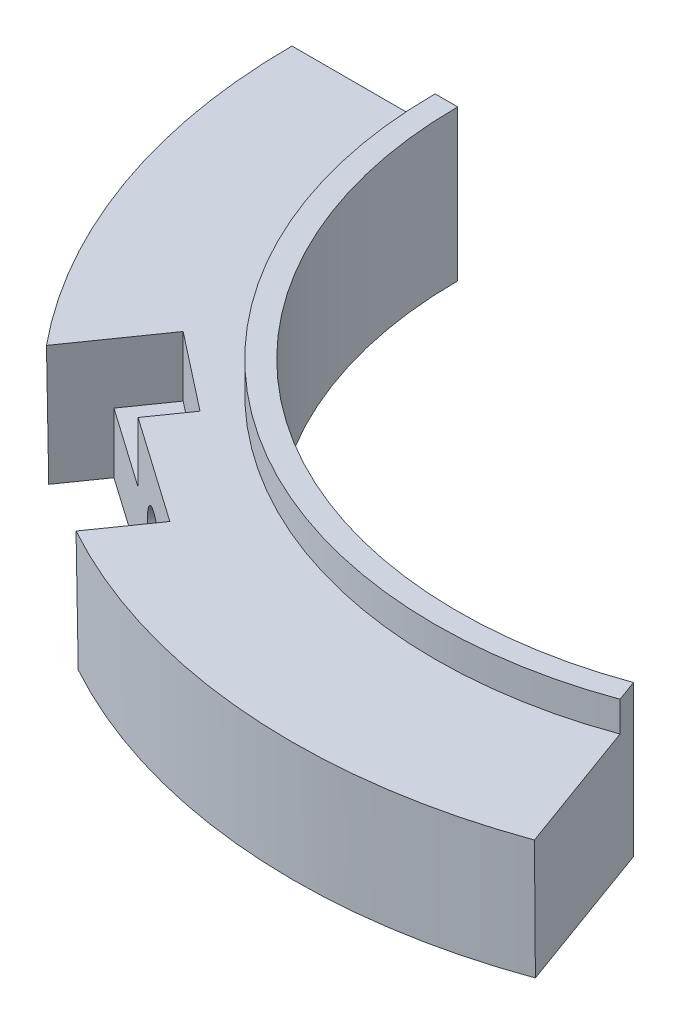
ISO-10303-21;
HEADER;
FILE_DESCRIPTION(('STEP AP214'),'2;1');
FILE_NAME('part.step','',(''),(''),'','','');
FILE_SCHEMA(('AUTOMOTIVE_DESIGN { 1 0 10303 214 1 1 1 1 }'));
ENDSEC;
DATA;
#1=APPLICATION_CONTEXT('core data for automotive mechanical design processes');
#2=APPLICATION_PROTOCOL_DEFINITION('international standard','automotive_design',2000,#1);
#3=PRODUCT_CONTEXT('',#1,'mechanical');
#4=PRODUCT('Part','Part','',(#3));
#5=PRODUCT_RELATED_PRODUCT_CATEGORY('part','',(#4));
#6=PRODUCT_DEFINITION_FORMATION('','',#4);
#7=PRODUCT_DEFINITION_CONTEXT('part definition',#1,'design');
#8=PRODUCT_DEFINITION('design','',#6,#7);
#9=PRODUCT_DEFINITION_SHAPE('','',#8);
#10=(LENGTH_UNIT() NAMED_UNIT(*) SI_UNIT(.MILLI.,.METRE.));
#11=(NAMED_UNIT(*) PLANE_ANGLE_UNIT() SI_UNIT($,.RADIAN.));
#12=(NAMED_UNIT(*) SI_UNIT($,.STERADIAN.) SOLID_ANGLE_UNIT());
#13=UNCERTAINTY_MEASURE_WITH_UNIT(LENGTH_MEASURE(1.E-05),#10,'distance_accuracy_value','');
#14=(GEOMETRIC_REPRESENTATION_CONTEXT(3) GLOBAL_UNCERTAINTY_ASSIGNED_CONTEXT((#13)) GLOBAL_UNIT_ASSIGNED_CONTEXT((#10,
#11,#12)) REPRESENTATION_CONTEXT('',''));
#15=CARTESIAN_POINT('',(0.,0.,0.));
#16=DIRECTION('',(0.,0.,1.));
#17=DIRECTION('',(1.,0.,0.));
#18=AXIS2_PLACEMENT_3D('',#15,#16,#17);
#19=CARTESIAN_POINT('',(0.,7.99999999999999,0.));
#20=DIRECTION('',(0.,1.,0.));
#21=DIRECTION('',(0.,0.,1.));
#22=AXIS2_PLACEMENT_3D('',#19,#20,#21);
#23=CONICAL_SURFACE('',#22,40.,0.0129481160065154);
#24=CARTESIAN_POINT('',(0.,0.000670605463265819,0.));
#25=DIRECTION('',(0.,-1.,0.));
#26=DIRECTION('',(0.,0.,-1.));
#27=AXIS2_PLACEMENT_3D('',#24,#25,#26);
#28=CIRCLE('',#27,39.8964179663232);
#29=CARTESIAN_POINT('',(-30.8760915944179,0.00067060546326582,25.2664032738471));
#30=VERTEX_POINT('',#29);
#31=CARTESIAN_POINT('',(-39.8964179663232,0.000670605463265819,0.));
#32=VERTEX_POINT('',#31);
#33=EDGE_CURVE('E285',#30,#32,#28,.T.);
#34=ORIENTED_EDGE('',*,*,#33,.F.);
#35=CARTESIAN_POINT('',(-30.8760900513762,0.000470605463265819,25.2664010701552));
#36=CARTESIAN_POINT('',(-30.8863766462704,1.33375881323339,25.2810918501495));
#37=CARTESIAN_POINT('',(-30.8966627154944,2.66704703332985,25.2957818794091));
#38=CARTESIAN_POINT('',(-30.9172338026023,5.33362349817542,25.3251604364587));
#39=CARTESIAN_POINT('',(-30.9275188204861,6.66691174292454,25.3398489642488));
#40=CARTESIAN_POINT('',(-30.9378033126998,8.0002,25.3545367413041));
#41=B_SPLINE_CURVE_WITH_KNOTS('',3,(#35,#36,#37,#38,#39,#40),.UNSPECIFIED.,.F.,.F.,(4,2,4),(0.,
4.00022645637086,8.00045291274171),.UNSPECIFIED.);
#42=CARTESIAN_POINT('',(-30.9378017699736,8.,25.3545345380628));
#43=VERTEX_POINT('',#42);
#44=EDGE_CURVE('E168',#30,#43,#41,.T.);
#45=ORIENTED_EDGE('',*,*,#44,.T.);
#46=CARTESIAN_POINT('',(0.,7.99999999999999,0.));
#47=DIRECTION('',(0.,-1.,0.));
#48=DIRECTION('',(0.,0.,-1.));
#49=AXIS2_PLACEMENT_3D('',#46,#47,#48);
#50=CIRCLE('',#49,40.);
#51=CARTESIAN_POINT('',(-40.,7.99999999999999,0.));
#52=VERTEX_POINT('',#51);
#53=EDGE_CURVE('E306',#43,#52,#50,.T.);
#54=ORIENTED_EDGE('',*,*,#53,.T.);
#55=DIRECTION('',(0.0129477542096046,-0.999916174317091,0.));
#56=VECTOR('',#55,1.);
#57=CARTESIAN_POINT('',(-40.,7.99999999999999,0.));
#58=LINE('',#57,#56);
#59=EDGE_CURVE('E289',#52,#32,#58,.T.);
#60=ORIENTED_EDGE('',*,*,#59,.T.);
#61=EDGE_LOOP('',(#34,#45,#54,#60));
#62=FACE_BOUND('',#61,.T.);
#63=ADVANCED_FACE('F34',(#62),#23,.T.);
#64=CARTESIAN_POINT('',(9.91858415644451,8.,27.2510860027913));
#65=DIRECTION('',(0.,-1.,0.));
#66=DIRECTION('',(0.,0.,-1.));
#67=AXIS2_PLACEMENT_3D('',#64,#65,#66);
#68=PLANE('',#67);
#69=DIRECTION('',(-0.573576436351045,0.,0.819152044288992));
#70=VECTOR('',#69,1.);
#71=CARTESIAN_POINT('',(-29.0934777198865,8.,22.7205668221443));
#72=LINE('',#71,#70);
#73=CARTESIAN_POINT('',(-27.2022359413972,8.,20.0195936459274));
#74=VERTEX_POINT('',#73);
#75=EDGE_CURVE('E169',#74,#43,#72,.T.);
#76=ORIENTED_EDGE('',*,*,#75,.F.);
#77=DIRECTION('',(-0.787674234570857,0.,-0.616091957578749));
#78=VECTOR('',#77,1.);
#79=CARTESIAN_POINT('',(-22.062861899645,8.,24.0394369709254));
#80=LINE('',#79,#78);
#81=CARTESIAN_POINT('',(-22.062861899645,8.,24.0394369709254));
#82=VERTEX_POINT('',#81);
#83=EDGE_CURVE('E155',#82,#74,#80,.T.);
#84=ORIENTED_EDGE('',*,*,#83,.F.);
#85=DIRECTION('',(0.573576436351044,0.,-0.819152044288993));
#86=VECTOR('',#85,1.);
#87=CARTESIAN_POINT('',(-23.7561974212202,8.,26.4577707208086));
#88=LINE('',#87,#86);
#89=CARTESIAN_POINT('',(-23.7561974212202,8.,26.4577707208086));
#90=VERTEX_POINT('',#89);
#91=EDGE_CURVE('E414',#90,#82,#88,.T.);
#92=ORIENTED_EDGE('',*,*,#91,.F.);
#93=DIRECTION('',(-0.819152044288993,0.,-0.573576436351044));
#94=VECTOR('',#93,1.);
#95=CARTESIAN_POINT('',(-0.787343563343156,8.,42.5407353361313));
#96=LINE('',#95,#94);
#97=CARTESIAN_POINT('',(-16.7242818511227,8.,31.3815710110451));
#98=VERTEX_POINT('',#97);
#99=EDGE_CURVE('E322',#98,#90,#96,.T.);
#100=ORIENTED_EDGE('',*,*,#99,.F.);
#101=DIRECTION('',(-0.573576436351045,0.,0.819152044288992));
#102=VECTOR('',#101,1.);
#103=CARTESIAN_POINT('',(-6.01835413133505,8.,16.0919216777051));
#104=LINE('',#103,#102);
#105=CARTESIAN_POINT('',(-19.2877505838145,7.99999999999999,35.0425837719847));
#106=VERTEX_POINT('',#105);
#107=EDGE_CURVE('E231',#98,#106,#104,.T.);
#108=ORIENTED_EDGE('',*,*,#107,.T.);
#109=CARTESIAN_POINT('',(13.6808057330269,7.99999999999999,37.5877048314363));
#110=VERTEX_POINT('',#109);
#111=EDGE_CURVE('E307',#110,#106,#50,.T.);
#112=ORIENTED_EDGE('',*,*,#111,.F.);
#113=DIRECTION('',(0.342020143325673,0.,0.939692620785907));
#114=VECTOR('',#113,1.);
#115=CARTESIAN_POINT('',(9.91858415644451,8.,27.2510860027913));
#116=LINE('',#115,#114);
#117=CARTESIAN_POINT('',(10.431614371433,8.,28.6606249339702));
#118=VERTEX_POINT('',#117);
#119=EDGE_CURVE('E295',#118,#110,#116,.T.);
#120=ORIENTED_EDGE('',*,*,#119,.F.);
#121=CARTESIAN_POINT('',(0.,8.,0.));
#122=DIRECTION('',(0.,-1.,0.));
#123=DIRECTION('',(0.,0.,-1.));
#124=AXIS2_PLACEMENT_3D('',#121,#122,#123);
#125=CIRCLE('',#124,30.5);
#126=CARTESIAN_POINT('',(-30.5,7.99999999999999,0.));
#127=VERTEX_POINT('',#126);
#128=EDGE_CURVE('E324',#118,#127,#125,.T.);
#129=ORIENTED_EDGE('',*,*,#128,.T.);
#130=DIRECTION('',(-1.,0.,0.));
#131=VECTOR('',#130,1.);
#132=CARTESIAN_POINT('',(-29.,8.,0.));
#133=LINE('',#132,#131);
#134=EDGE_CURVE('E337',#127,#52,#133,.T.);
#135=ORIENTED_EDGE('',*,*,#134,.T.);
#136=ORIENTED_EDGE('',*,*,#53,.F.);
#137=EDGE_LOOP('',(#76,#84,#92,#100,#108,#112,#120,#129,#135,#136));
#138=FACE_BOUND('',#137,.T.);
#139=ADVANCED_FACE('F274',(#138),#68,.F.);
#140=CARTESIAN_POINT('',(0.,0.,0.));
#141=DIRECTION('',(0.,-1.,0.));
#142=DIRECTION('',(0.,0.,-1.));
#143=AXIS2_PLACEMENT_3D('',#140,#141,#142);
#144=CYLINDRICAL_SURFACE('',#143,29.);
#145=CARTESIAN_POINT('',(-16.6932287008392,0.649474551576168,23.7136272118265));
#146=CARTESIAN_POINT('',(-16.5489999556268,0.64948214656556,23.8151544921271));
#147=CARTESIAN_POINT('',(-16.4037439585356,0.664338604365094,23.9154215427874));
#148=CARTESIAN_POINT('',(-16.1154682046601,0.723376379007501,24.1106218136091));
#149=CARTESIAN_POINT('',(-15.9724510424347,0.767589464135116,24.2055491345346));
#150=CARTESIAN_POINT('',(-15.6931209410602,0.884033140541949,24.3875733311172));
#151=CARTESIAN_POINT('',(-15.5568038638344,0.956246187246734,24.4746750682164));
#152=CARTESIAN_POINT('',(-15.294984883665,1.12660442333295,24.6391430593461));
#153=CARTESIAN_POINT('',(-15.1694809311329,1.22474468390133,24.7165111596373));
#154=CARTESIAN_POINT('',(-14.932723824081,1.44461432831995,24.8602703957436));
#155=CARTESIAN_POINT('',(-14.821525867094,1.56643077946276,24.9266192859318));
#156=CARTESIAN_POINT('',(-14.6175122704299,1.83000864498745,25.0468039865723));
#157=CARTESIAN_POINT('',(-14.524697507627,1.97177101023343,25.1006392001463));
#158=CARTESIAN_POINT('',(-14.3603233498682,2.27165723790005,25.195042227695));
#159=CARTESIAN_POINT('',(-14.2888180309886,2.42982137568048,25.2355763138507));
#160=CARTESIAN_POINT('',(-14.169836482929,2.7577429622307,25.3025774246436));
#161=CARTESIAN_POINT('',(-14.1223595593769,2.92750007582608,25.3290448557797));
#162=CARTESIAN_POINT('',(-14.0532448125366,3.27307580418684,25.367457175145));
#163=CARTESIAN_POINT('',(-14.0315053730862,3.44886774233842,25.379459178862));
#164=CARTESIAN_POINT('',(-14.0143003498141,3.80211861102713,25.388963895097));
#165=CARTESIAN_POINT('',(-14.0188339587404,3.97957749017943,25.3864670530989));
#166=CARTESIAN_POINT('',(-14.0539344207779,4.33032261974512,25.3670517964536));
#167=CARTESIAN_POINT('',(-14.0843895545301,4.50362350001804,25.3501952704377));
#168=CARTESIAN_POINT('',(-14.1701127401262,4.84194300421424,25.3023772222597));
#169=CARTESIAN_POINT('',(-14.2253811811965,5.00696149817329,25.2714154788404));
#170=CARTESIAN_POINT('',(-14.3589696041779,5.32443095731625,25.1957509769842));
#171=CARTESIAN_POINT('',(-14.4373377924936,5.47685477860741,25.1510194739636));
#172=CARTESIAN_POINT('',(-14.6144522540094,5.76451098077571,25.048517327861));
#173=CARTESIAN_POINT('',(-14.713199231329,5.89974276737966,24.9907462342339));
#174=CARTESIAN_POINT('',(-14.9284159747827,6.14991377023516,24.862785716952));
#175=CARTESIAN_POINT('',(-15.0449753493423,6.26474365242543,24.7925331951435));
#176=CARTESIAN_POINT('',(-15.2917026261313,6.47000258894143,24.6411190007649));
#177=CARTESIAN_POINT('',(-15.4218705480971,6.56043160787822,24.5599573123732));
#178=CARTESIAN_POINT('',(-15.6917707801985,6.7143189095837,24.388396319614));
#179=CARTESIAN_POINT('',(-15.831505196858,6.77777122981352,24.2979949785186));
#180=CARTESIAN_POINT('',(-16.1162226230965,6.87582170067299,24.110089957242));
#181=CARTESIAN_POINT('',(-16.2612054471995,6.91042086992089,24.0125865279217));
#182=CARTESIAN_POINT('',(-16.5513422063985,6.94964323220379,23.813522631559));
#183=CARTESIAN_POINT('',(-16.6964915637939,6.95441721413793,23.7119851889403));
#184=CARTESIAN_POINT('',(-16.9835199275088,6.93425033432527,23.5072569263861));
#185=CARTESIAN_POINT('',(-17.1253989860754,6.90930994763858,23.4040661329097));
#186=CARTESIAN_POINT('',(-17.4016378380506,6.83054745272621,23.199407216518));
#187=CARTESIAN_POINT('',(-17.5360152275116,6.77679636273557,23.0979354879191));
#188=CARTESIAN_POINT('',(-17.7941265933511,6.64201151218522,22.8996848736341));
#189=CARTESIAN_POINT('',(-17.9178602907999,6.56097703690759,22.8029061109613));
#190=CARTESIAN_POINT('',(-18.1520836221764,6.3735546573513,22.6169039581311));
#191=CARTESIAN_POINT('',(-18.2625191840447,6.26706817125197,22.5277118207458));
#192=CARTESIAN_POINT('',(-18.4669570911248,6.03190527229278,22.3604333021115));
#193=CARTESIAN_POINT('',(-18.5609589478609,5.90322820006542,22.2823472509928));
#194=CARTESIAN_POINT('',(-18.7307367590176,5.62667681043193,22.1398254990495));
#195=CARTESIAN_POINT('',(-18.8064332746414,5.47872296180764,22.0754494339169));
#196=CARTESIAN_POINT('',(-18.9373628341602,5.16820810750318,21.9632364607781));
#197=CARTESIAN_POINT('',(-18.9925962008302,5.00564733227533,21.9153992918965));
#198=CARTESIAN_POINT('',(-19.0812659982208,4.67086716025938,21.838240752812));
#199=CARTESIAN_POINT('',(-19.1147468791267,4.49866824612972,21.8088816274592));
#200=CARTESIAN_POINT('',(-19.1593370811455,4.14922552791051,21.7697197390596));
#201=CARTESIAN_POINT('',(-19.1704471702185,3.97198189721136,21.7599163046914));
#202=CARTESIAN_POINT('',(-19.1700483522398,3.61846811660654,21.7602675542439));
#203=CARTESIAN_POINT('',(-19.1586570973353,3.44219771020977,21.7703184265163));
#204=CARTESIAN_POINT('',(-19.1137454613566,3.09471436495632,21.8097596187874));
#205=CARTESIAN_POINT('',(-19.0802250617306,2.92350143033967,21.8391499549993));
#206=CARTESIAN_POINT('',(-18.9918106977869,2.59100061415647,21.9160793683163));
#207=CARTESIAN_POINT('',(-18.9369209739132,2.42971077083976,21.9636148447354));
#208=CARTESIAN_POINT('',(-18.8069865498785,2.12152061542658,22.0749755605313));
#209=CARTESIAN_POINT('',(-18.7319418444426,1.97462030709597,22.1388008041713));
#210=CARTESIAN_POINT('',(-18.5629463616414,1.69858022757664,22.2806916924656));
#211=CARTESIAN_POINT('',(-18.4689025347671,1.5695333503358,22.3588272396232));
#212=CARTESIAN_POINT('',(-18.2642790566204,1.33365812734902,22.5262857730101));
#213=CARTESIAN_POINT('',(-18.1536954712934,1.22683508213214,22.6156114200308));
#214=CARTESIAN_POINT('',(-17.9183153333047,1.03818670109254,22.8025571538631));
#215=CARTESIAN_POINT('',(-17.7934782443324,0.956435226578116,22.9002006858224));
#216=CARTESIAN_POINT('',(-17.5330758769043,0.820783703932582,23.1001751188821));
#217=CARTESIAN_POINT('',(-17.3975227502445,0.766852615959477,23.2025006567244));
#218=CARTESIAN_POINT('',(-17.1666089802473,0.70164951429629,23.373503624662));
#219=CARTESIAN_POINT('',(-17.0732250014389,0.682111074041779,23.4418118157774));
#220=CARTESIAN_POINT('',(-16.8844547725775,0.656021102259471,23.5781412293489));
#221=CARTESIAN_POINT('',(-16.7890685327052,0.649469504714634,23.646162453262));
#222=CARTESIAN_POINT('',(-16.6932287008392,0.649474551576168,23.7136272118265));
#223=B_SPLINE_CURVE_WITH_KNOTS('',3,(#145,#146,#147,#148,#149,#150,#151,#152,#153,#154,#155,
#156,#157,#158,#159,#160,#161,#162,#163,#164,#165,#166,#167,#168,#169,#170,#171,#172,#173,#174,
#175,#176,#177,#178,#179,#180,#181,#182,#183,#184,#185,#186,#187,#188,#189,#190,#191,#192,#193,
#194,#195,#196,#197,#198,#199,#200,#201,#202,#203,#204,#205,#206,#207,#208,#209,#210,#211,#212,
#213,#214,#215,#216,#217,#218,#219,#220,#221,#222),.UNSPECIFIED.,.T.,.F.,(4,2,2,2,2,2,2,2,2,2,2,
2,2,2,2,2,2,2,2,2,2,2,2,2,2,2,2,2,2,2,2,2,2,2,2,2,2,2,4),(0.,0.52871040460765,1.0579938878802,
1.58694626048054,2.11579815048801,2.64663296149886,3.17749308711254,3.7096891019091,
4.24186973644208,4.77194214481608,5.30199826654555,5.82978139684763,6.35757280634521,
6.88647354697578,7.41539256503064,7.94706576503542,8.47873973612954,9.01053115972378,
9.54230380840551,10.0713857534895,10.6004592399601,11.1282345206174,11.6560236279975,
12.1858910981398,12.7157743153923,13.2479173567005,13.7800520039039,14.3110958099924,
14.8421213857274,15.3703777519355,15.898634561005,16.4267865982752,16.9549387737673,
17.4857432095958,18.016674100977,18.5491544232548,19.0810393530426,19.4323685821309,
19.783696025275),.UNSPECIFIED.);
#224=CARTESIAN_POINT('',(-16.6932287008392,0.649474551576168,23.7136272118265));
#225=VERTEX_POINT('',#224);
#226=CARTESIAN_POINT('',(-16.6932287008392,6.94947455157617,23.7136272118265));
#227=VERTEX_POINT('',#226);
#228=EDGE_CURVE('E212',#225,#227,#223,.T.);
#229=ORIENTED_EDGE('',*,*,#228,.T.);
#230=EDGE_CURVE('E220',#227,#225,#223,.T.);
#231=ORIENTED_EDGE('',*,*,#230,.T.);
#232=EDGE_LOOP('',(#229,#231));
#233=FACE_BOUND('',#232,.T.);
#234=CARTESIAN_POINT('',(0.,0.,0.));
#235=DIRECTION('',(0.,-1.,0.));
#236=DIRECTION('',(0.,0.,-1.));
#237=AXIS2_PLACEMENT_3D('',#234,#235,#236);
#238=CIRCLE('',#237,29.);
#239=CARTESIAN_POINT('',(9.91858415644451,0.,27.2510860027913));
#240=VERTEX_POINT('',#239);
#241=CARTESIAN_POINT('',(-29.,0.,0.));
#242=VERTEX_POINT('',#241);
#243=EDGE_CURVE('E62',#240,#242,#238,.T.);
#244=ORIENTED_EDGE('',*,*,#243,.T.);
#245=DIRECTION('',(0.,1.,0.));
#246=VECTOR('',#245,1.);
#247=CARTESIAN_POINT('',(-29.,0.,0.));
#248=LINE('',#247,#246);
#249=CARTESIAN_POINT('',(-29.,10.,0.));
#250=VERTEX_POINT('',#249);
#251=EDGE_CURVE('E278',#242,#250,#248,.T.);
#252=ORIENTED_EDGE('',*,*,#251,.T.);
#253=CARTESIAN_POINT('',(0.,10.,0.));
#254=DIRECTION('',(0.,1.,0.));
#255=DIRECTION('',(0.,0.,1.));
#256=AXIS2_PLACEMENT_3D('',#253,#254,#255);
#257=CIRCLE('',#256,29.);
#258=CARTESIAN_POINT('',(9.9185841564445,10.,27.2510860027913));
#259=VERTEX_POINT('',#258);
#260=EDGE_CURVE('E330',#250,#259,#257,.T.);
#261=ORIENTED_EDGE('',*,*,#260,.T.);
#262=DIRECTION('',(0.,1.,0.));
#263=VECTOR('',#262,1.);
#264=CARTESIAN_POINT('',(9.91858415644451,0.,27.2510860027913));
#265=LINE('',#264,#263);
#266=EDGE_CURVE('E280',#240,#259,#265,.T.);
#267=ORIENTED_EDGE('',*,*,#266,.F.);
#268=EDGE_LOOP('',(#244,#252,#261,#267));
#269=FACE_BOUND('',#268,.T.);
#270=ADVANCED_FACE('F36',(#233,#269),#144,.F.);
#271=CARTESIAN_POINT('',(0.,0.000670605463265819,0.));
#272=DIRECTION('',(0.,1.,0.));
#273=DIRECTION('',(0.,0.,1.));
#274=AXIS2_PLACEMENT_3D('',#271,#272,#273);
#275=CONICAL_SURFACE('',#274,39.8964179663232,1.57073478313307);
#276=CARTESIAN_POINT('',(-29.0936777198865,0.00048707027842584,22.7204267806367));
#277=CARTESIAN_POINT('',(-27.3188482906565,0.000447327702143533,23.96317572602));
#278=CARTESIAN_POINT('',(-25.5440188613637,0.000419544427064887,25.2059246714472));
#279=CARTESIAN_POINT('',(-21.4208202384896,0.000382782929756702,28.0930194287196));
#280=CARTESIAN_POINT('',(-19.0724510448611,0.000382782929756702,29.7373652405977));
#281=CARTESIAN_POINT('',(-16.7240818511227,0.000403720453189899,31.3817110525528));
#282=B_SPLINE_CURVE_WITH_KNOTS('',3,(#276,#277,#278,#279,#280,#281),.UNSPECIFIED.,.F.,.F.,(4,2,
4),(0.,6.5000000005344,15.1004883103699),.UNSPECIFIED.);
#283=CARTESIAN_POINT('',(-29.0934777198865,0.000487065882157831,22.7205668221443));
#284=VERTEX_POINT('',#283);
#285=CARTESIAN_POINT('',(-16.7242818511227,0.000403718636132755,31.3815710110451));
#286=VERTEX_POINT('',#285);
#287=EDGE_CURVE('E47',#284,#286,#282,.T.);
#288=ORIENTED_EDGE('',*,*,#287,.F.);
#289=CARTESIAN_POINT('',(-29.0933376783789,0.000487051513461927,22.7203668221443));
#290=CARTESIAN_POINT('',(-29.6352535858578,0.00054267664405605,23.4943029452322));
#291=CARTESIAN_POINT('',(-30.1771694933314,0.000598456889089361,24.2682390683125));
#292=CARTESIAN_POINT('',(-31.2610013082682,0.000710327608034357,25.8161113144581));
#293=CARTESIAN_POINT('',(-31.8029172157313,0.000766418081946042,26.5900474375234));
#294=CARTESIAN_POINT('',(-32.3448331231891,0.000822663670296915,27.3639835605812));
#295=B_SPLINE_CURVE_WITH_KNOTS('',3,(#289,#290,#291,#292,#293,#294),.UNSPECIFIED.,.F.,.F.,(4,2,
4),(0.,2.83440466208291,5.6688093241658),.UNSPECIFIED.);
#296=EDGE_CURVE('E11',#284,#30,#295,.T.);
#297=ORIENTED_EDGE('',*,*,#296,.T.);
#298=ORIENTED_EDGE('',*,*,#33,.T.);
#299=DIRECTION('',(0.999999998106189,-6.15436617860995E-05,0.));
#300=VECTOR('',#299,1.);
#301=CARTESIAN_POINT('',(-39.8964179663232,0.000670605463265819,0.));
#302=LINE('',#301,#300);
#303=EDGE_CURVE('E283',#32,#242,#302,.T.);
#304=ORIENTED_EDGE('',*,*,#303,.T.);
#305=ORIENTED_EDGE('',*,*,#243,.F.);
#306=DIRECTION('',(-0.342020142677951,-6.15436617860995E-05,-0.939692619006307));
#307=VECTOR('',#306,1.);
#308=CARTESIAN_POINT('',(13.6453785910228,0.000670605463265819,37.4903695587442));
#309=LINE('',#308,#307);
#310=CARTESIAN_POINT('',(13.6453785910228,0.000670605463265819,37.4903695587442));
#311=VERTEX_POINT('',#310);
#312=EDGE_CURVE('E303',#311,#240,#309,.T.);
#313=ORIENTED_EDGE('',*,*,#312,.F.);
#314=CARTESIAN_POINT('',(-19.2279911675737,0.000670605463265757,34.9572384807962));
#315=VERTEX_POINT('',#314);
#316=EDGE_CURVE('E281',#311,#315,#28,.T.);
#317=ORIENTED_EDGE('',*,*,#316,.T.);
#318=CARTESIAN_POINT('',(-19.5802302346281,0.000708183215487837,35.4602880023067));
#319=CARTESIAN_POINT('',(-19.1042154971274,0.000657393711127306,34.7804685037652));
#320=CARTESIAN_POINT('',(-18.628200759626,0.000606625667673611,34.1006490052227));
#321=CARTESIAN_POINT('',(-17.6761712846217,0.000505132502579891,32.7410100081355));
#322=CARTESIAN_POINT('',(-17.2001565471188,0.000454407380939866,32.0611905095909));
#323=CARTESIAN_POINT('',(-16.7241418096151,0.000403703720206676,31.3813710110451));
#324=B_SPLINE_CURVE_WITH_KNOTS('',3,(#318,#319,#320,#321,#322,#323),.UNSPECIFIED.,.F.,.F.,(4,2,
4),(0.,2.48971911095425,4.97943822190849),.UNSPECIFIED.);
#325=EDGE_CURVE('E224',#315,#286,#324,.T.);
#326=ORIENTED_EDGE('',*,*,#325,.T.);
#327=EDGE_LOOP('',(#288,#297,#298,#304,#305,#313,#317,#326));
#328=FACE_BOUND('',#327,.T.);
#329=ADVANCED_FACE('F233',(#328),#275,.T.);
#330=ORIENTED_EDGE('',*,*,#111,.T.);
#331=CARTESIAN_POINT('',(-19.2877520779025,8.0002,35.0425859057634));
#332=CARTESIAN_POINT('',(-19.2777918285101,6.66691176414039,35.028361195447));
#333=CARTESIAN_POINT('',(-19.2678315034421,5.33362352999919,35.0141363770546));
#334=CARTESIAN_POINT('',(-19.2479107019547,2.66704706515362,34.9856865241177));
#335=CARTESIAN_POINT('',(-19.2379502255353,1.33375883444924,34.9714614895732));
#336=CARTESIAN_POINT('',(-19.2279896734403,0.000470605463265477,34.9572363469526));
#337=B_SPLINE_CURVE_WITH_KNOTS('',3,(#331,#332,#333,#334,#335,#336),.UNSPECIFIED.,.F.,.F.,(4,2,
4),(0.,4.00020394723794,8.00040789447588),.UNSPECIFIED.);
#338=EDGE_CURVE('E244',#106,#315,#337,.T.);
#339=ORIENTED_EDGE('',*,*,#338,.T.);
#340=ORIENTED_EDGE('',*,*,#316,.F.);
#341=DIRECTION('',(-0.00442839275051456,-0.999916174317091,-0.0121669090865151));
#342=VECTOR('',#341,1.);
#343=CARTESIAN_POINT('',(13.6808057330269,7.99999999999999,37.5877048314363));
#344=LINE('',#343,#342);
#345=EDGE_CURVE('E297',#110,#311,#344,.T.);
#346=ORIENTED_EDGE('',*,*,#345,.F.);
#347=EDGE_LOOP('',(#330,#339,#340,#346));
#348=FACE_BOUND('',#347,.T.);
#349=ADVANCED_FACE('F184',(#348),#23,.T.);
#350=CARTESIAN_POINT('',(0.,0.,0.));
#351=DIRECTION('',(-0.939692620785907,0.,0.342020143325673));
#352=DIRECTION('',(0.342020143325673,0.,0.939692620785907));
#353=AXIS2_PLACEMENT_3D('',#350,#351,#352);
#354=PLANE('',#353);
#355=ORIENTED_EDGE('',*,*,#266,.T.);
#356=DIRECTION('',(-0.342020143325679,0.,-0.939692620785905));
#357=VECTOR('',#356,1.);
#358=CARTESIAN_POINT('',(10.431614371433,10.,28.6606249339702));
#359=LINE('',#358,#357);
#360=CARTESIAN_POINT('',(10.431614371433,10.,28.6606249339702));
#361=VERTEX_POINT('',#360);
#362=EDGE_CURVE('E325',#361,#259,#359,.T.);
#363=ORIENTED_EDGE('',*,*,#362,.F.);
#364=DIRECTION('',(0.,-1.,0.));
#365=VECTOR('',#364,1.);
#366=CARTESIAN_POINT('',(10.431614371433,10.,28.6606249339702));
#367=LINE('',#366,#365);
#368=EDGE_CURVE('E317',#361,#118,#367,.T.);
#369=ORIENTED_EDGE('',*,*,#368,.T.);
#370=ORIENTED_EDGE('',*,*,#119,.T.);
#371=ORIENTED_EDGE('',*,*,#345,.T.);
#372=ORIENTED_EDGE('',*,*,#312,.T.);
#373=EDGE_LOOP('',(#355,#363,#369,#370,#371,#372));
#374=FACE_BOUND('',#373,.T.);
#375=ADVANCED_FACE('F313',(#374),#354,.F.);
#376=CARTESIAN_POINT('',(0.,0.,0.));
#377=DIRECTION('',(0.,0.,-1.));
#378=DIRECTION('',(-1.,0.,0.));
#379=AXIS2_PLACEMENT_3D('',#376,#377,#378);
#380=PLANE('',#379);
#381=ORIENTED_EDGE('',*,*,#134,.F.);
#382=DIRECTION('',(0.,-1.,0.));
#383=VECTOR('',#382,1.);
#384=CARTESIAN_POINT('',(-30.5,10.,0.));
#385=LINE('',#384,#383);
#386=CARTESIAN_POINT('',(-30.5,10.,0.));
#387=VERTEX_POINT('',#386);
#388=EDGE_CURVE('E54',#387,#127,#385,.T.);
#389=ORIENTED_EDGE('',*,*,#388,.F.);
#390=DIRECTION('',(-1.,0.,0.));
#391=VECTOR('',#390,1.);
#392=CARTESIAN_POINT('',(-29.,10.,0.));
#393=LINE('',#392,#391);
#394=EDGE_CURVE('E293',#250,#387,#393,.T.);
#395=ORIENTED_EDGE('',*,*,#394,.F.);
#396=ORIENTED_EDGE('',*,*,#251,.F.);
#397=ORIENTED_EDGE('',*,*,#303,.F.);
#398=ORIENTED_EDGE('',*,*,#59,.F.);
#399=EDGE_LOOP('',(#381,#389,#395,#396,#397,#398));
#400=FACE_BOUND('',#399,.T.);
#401=ADVANCED_FACE('F292',(#400),#380,.T.);
#402=CARTESIAN_POINT('',(0.,10.,0.));
#403=DIRECTION('',(0.,-1.,0.));
#404=DIRECTION('',(0.,0.,-1.));
#405=AXIS2_PLACEMENT_3D('',#402,#403,#404);
#406=CYLINDRICAL_SURFACE('',#405,30.5);
#407=ORIENTED_EDGE('',*,*,#128,.F.);
#408=ORIENTED_EDGE('',*,*,#368,.F.);
#409=CARTESIAN_POINT('',(0.,10.,0.));
#410=DIRECTION('',(0.,-1.,0.));
#411=DIRECTION('',(0.,0.,-1.));
#412=AXIS2_PLACEMENT_3D('',#409,#410,#411);
#413=CIRCLE('',#412,30.5);
#414=EDGE_CURVE('E333',#361,#387,#413,.T.);
#415=ORIENTED_EDGE('',*,*,#414,.T.);
#416=ORIENTED_EDGE('',*,*,#388,.T.);
#417=EDGE_LOOP('',(#407,#408,#415,#416));
#418=FACE_BOUND('',#417,.T.);
#419=ADVANCED_FACE('F341',(#418),#406,.T.);
#420=CARTESIAN_POINT('',(0.,10.,0.));
#421=DIRECTION('',(0.,1.,0.));
#422=DIRECTION('',(0.,0.,1.));
#423=AXIS2_PLACEMENT_3D('',#420,#421,#422);
#424=PLANE('',#423);
#425=ORIENTED_EDGE('',*,*,#362,.T.);
#426=ORIENTED_EDGE('',*,*,#260,.F.);
#427=ORIENTED_EDGE('',*,*,#394,.T.);
#428=ORIENTED_EDGE('',*,*,#414,.F.);
#429=EDGE_LOOP('',(#425,#426,#427,#428));
#430=FACE_BOUND('',#429,.T.);
#431=ADVANCED_FACE('F344',(#430),#424,.T.);
#432=CARTESIAN_POINT('',(-16.7242818511227,29.4599872702357,31.3815710110451));
#433=DIRECTION('',(-0.573576436351044,0.,0.819152044288993));
#434=DIRECTION('',(0.819152044288993,0.,0.573576436351044));
#435=AXIS2_PLACEMENT_3D('',#432,#433,#434);
#436=PLANE('',#435);
#437=DIRECTION('',(0.,1.,0.));
#438=VECTOR('',#437,1.);
#439=CARTESIAN_POINT('',(-23.7561974212202,4.,26.4577707208086));
#440=LINE('',#439,#438);
#441=CARTESIAN_POINT('',(-23.7561974212202,4.,26.4577707208086));
#442=VERTEX_POINT('',#441);
#443=EDGE_CURVE('E163',#442,#90,#440,.T.);
#444=ORIENTED_EDGE('',*,*,#443,.F.);
#445=DIRECTION('',(0.819152044288993,0.,0.573576436351045));
#446=VECTOR('',#445,1.);
#447=CARTESIAN_POINT('',(-29.0934777198865,4.,22.7205668221443));
#448=LINE('',#447,#446);
#449=CARTESIAN_POINT('',(-29.0934777198865,4.,22.7205668221443));
#450=VERTEX_POINT('',#449);
#451=EDGE_CURVE('E148',#450,#442,#448,.T.);
#452=ORIENTED_EDGE('',*,*,#451,.F.);
#453=DIRECTION('',(0.,1.,0.));
#454=VECTOR('',#453,1.);
#455=CARTESIAN_POINT('',(-29.0934777198865,0.,22.7205668221443));
#456=LINE('',#455,#454);
#457=EDGE_CURVE('E161',#284,#450,#456,.T.);
#458=ORIENTED_EDGE('',*,*,#457,.F.);
#459=ORIENTED_EDGE('',*,*,#287,.T.);
#460=DIRECTION('',(0.,1.,0.));
#461=VECTOR('',#460,1.);
#462=CARTESIAN_POINT('',(-16.7242818511227,29.4599872702357,31.3815710110451));
#463=LINE('',#462,#461);
#464=EDGE_CURVE('E219',#286,#98,#463,.T.);
#465=ORIENTED_EDGE('',*,*,#464,.T.);
#466=ORIENTED_EDGE('',*,*,#99,.T.);
#467=EDGE_LOOP('',(#444,#452,#458,#459,#465,#466));
#468=FACE_BOUND('',#467,.T.);
#469=CARTESIAN_POINT('',(-20.3191378496194,3.79947455157617,28.8644257421194));
#470=DIRECTION('',(-0.573576436351044,0.,0.819152044288993));
#471=DIRECTION('',(0.819152044288993,0.,0.573576436351044));
#472=AXIS2_PLACEMENT_3D('',#469,#470,#471);
#473=ELLIPSE('',#472,1.7000053440257,1.69999999999999);
#474=CARTESIAN_POINT('',(-18.9265749967586,3.79947455157608,29.8395087491233));
#475=VERTEX_POINT('',#474);
#476=EDGE_CURVE('E257',#475,#475,#473,.T.);
#477=ORIENTED_EDGE('',*,*,#476,.F.);
#478=EDGE_LOOP('',(#477));
#479=FACE_BOUND('',#478,.T.);
#480=ADVANCED_FACE('F159',(#468,#479),#436,.T.);
#481=CARTESIAN_POINT('',(3.52235379044269,0.,2.46637867630951));
#482=DIRECTION('',(0.819152044288993,0.,0.573576436351045));
#483=DIRECTION('',(0.573576436351045,0.,-0.819152044288992));
#484=AXIS2_PLACEMENT_3D('',#481,#482,#483);
#485=PLANE('',#484);
#486=ORIENTED_EDGE('',*,*,#464,.F.);
#487=ORIENTED_EDGE('',*,*,#325,.F.);
#488=ORIENTED_EDGE('',*,*,#338,.F.);
#489=ORIENTED_EDGE('',*,*,#107,.F.);
#490=EDGE_LOOP('',(#486,#487,#488,#489));
#491=FACE_BOUND('',#490,.T.);
#492=ADVANCED_FACE('F235',(#491),#485,.F.);
#493=CARTESIAN_POINT('',(-16.6932287008392,3.79947455157617,23.7136272118265));
#494=DIRECTION('',(0.575628575891007,0.,-0.817711283166431));
#495=DIRECTION('',(-0.817711283166431,0.,-0.575628575891007));
#496=AXIS2_PLACEMENT_3D('',#493,#494,#495);
#497=CYLINDRICAL_SURFACE('',#496,3.15);
#498=CARTESIAN_POINT('',(-16.6932287008392,3.79947455157617,23.7136272118265));
#499=DIRECTION('',(0.575628575891007,0.,-0.817711283166431));
#500=DIRECTION('',(-0.817711283166431,0.,-0.575628575891007));
#501=AXIS2_PLACEMENT_3D('',#498,#499,#500);
#502=CIRCLE('',#501,3.15);
#503=EDGE_CURVE('E172',#227,#225,#502,.T.);
#504=ORIENTED_EDGE('',*,*,#503,.F.);
#505=ORIENTED_EDGE('',*,*,#228,.F.);
#506=EDGE_LOOP('',(#504,#505));
#507=FACE_BOUND('',#506,.T.);
#508=ADVANCED_FACE('F207',(#507),#497,.F.);
#509=CARTESIAN_POINT('',(-16.6932287008392,3.79947455157617,23.7136272118265));
#510=DIRECTION('',(0.575628575891007,0.,-0.817711283166431));
#511=DIRECTION('',(-0.817711283166431,0.,-0.575628575891007));
#512=AXIS2_PLACEMENT_3D('',#509,#510,#511);
#513=CIRCLE('',#512,3.15);
#514=EDGE_CURVE('E221',#225,#227,#513,.T.);
#515=ORIENTED_EDGE('',*,*,#514,.F.);
#516=ORIENTED_EDGE('',*,*,#230,.F.);
#517=EDGE_LOOP('',(#515,#516));
#518=FACE_BOUND('',#517,.T.);
#519=ADVANCED_FACE('F202',(#518),#497,.F.);
#520=CARTESIAN_POINT('',(-16.6932287008392,3.79947455157617,23.7136272118265));
#521=DIRECTION('',(0.575628575891007,0.,-0.817711283166431));
#522=DIRECTION('',(-0.817711283166431,0.,-0.575628575891007));
#523=AXIS2_PLACEMENT_3D('',#520,#521,#522);
#524=CYLINDRICAL_SURFACE('',#523,1.69999999999999);
#525=ORIENTED_EDGE('',*,*,#476,.T.);
#526=EDGE_LOOP('',(#525));
#527=FACE_BOUND('',#526,.T.);
#528=CARTESIAN_POINT('',(-17.5278901358812,3.79947455157617,24.8993085724178));
#529=DIRECTION('',(0.575628575891007,0.,-0.817711283166431));
#530=DIRECTION('',(-0.817711283166431,0.,-0.575628575891007));
#531=AXIS2_PLACEMENT_3D('',#528,#529,#530);
#532=CIRCLE('',#531,1.69999999999999);
#533=CARTESIAN_POINT('',(-18.9179993172641,3.79947455157617,23.9207399934031));
#534=VERTEX_POINT('',#533);
#535=EDGE_CURVE('E259',#534,#534,#532,.T.);
#536=ORIENTED_EDGE('',*,*,#535,.T.);
#537=EDGE_LOOP('',(#536));
#538=FACE_BOUND('',#537,.T.);
#539=ADVANCED_FACE('F198',(#527,#538),#524,.F.);
#540=CARTESIAN_POINT('',(-16.6932287008392,3.79947455157617,23.7136272118265));
#541=DIRECTION('',(0.575628575891007,0.,-0.817711283166431));
#542=DIRECTION('',(-0.817711283166431,0.,-0.575628575891007));
#543=AXIS2_PLACEMENT_3D('',#540,#541,#542);
#544=CONICAL_SURFACE('',#543,3.15,0.78539816339745);
#545=ORIENTED_EDGE('',*,*,#535,.F.);
#546=EDGE_LOOP('',(#545));
#547=FACE_BOUND('',#546,.T.);
#548=ORIENTED_EDGE('',*,*,#503,.T.);
#549=ORIENTED_EDGE('',*,*,#514,.T.);
#550=EDGE_LOOP('',(#548,#549));
#551=FACE_BOUND('',#550,.T.);
#552=ADVANCED_FACE('F192',(#547,#551),#544,.F.);
#553=CARTESIAN_POINT('',(-29.0934777198865,0.,22.7205668221443));
#554=DIRECTION('',(-0.819152044288993,0.,-0.573576436351045));
#555=DIRECTION('',(-0.573576436351045,0.,0.819152044288993));
#556=AXIS2_PLACEMENT_3D('',#553,#554,#555);
#557=PLANE('',#556);
#558=ORIENTED_EDGE('',*,*,#296,.F.);
#559=ORIENTED_EDGE('',*,*,#457,.T.);
#560=DIRECTION('',(-0.573576436351045,0.,0.819152044288993));
#561=VECTOR('',#560,1.);
#562=CARTESIAN_POINT('',(-27.2022359413972,4.,20.0195936459274));
#563=LINE('',#562,#561);
#564=CARTESIAN_POINT('',(-27.2022359413972,4.,20.0195936459274));
#565=VERTEX_POINT('',#564);
#566=EDGE_CURVE('E144',#565,#450,#563,.T.);
#567=ORIENTED_EDGE('',*,*,#566,.F.);
#568=DIRECTION('',(0.,1.,0.));
#569=VECTOR('',#568,1.);
#570=CARTESIAN_POINT('',(-27.2022359413972,4.,20.0195936459274));
#571=LINE('',#570,#569);
#572=EDGE_CURVE('E174',#565,#74,#571,.T.);
#573=ORIENTED_EDGE('',*,*,#572,.T.);
#574=ORIENTED_EDGE('',*,*,#75,.T.);
#575=ORIENTED_EDGE('',*,*,#44,.F.);
#576=EDGE_LOOP('',(#558,#559,#567,#573,#574,#575));
#577=FACE_BOUND('',#576,.T.);
#578=ADVANCED_FACE('F167',(#577),#557,.F.);
#579=CARTESIAN_POINT('',(-22.062861899645,4.,24.0394369709254));
#580=DIRECTION('',(0.616091957578749,0.,-0.787674234570857));
#581=DIRECTION('',(-0.787674234570857,0.,-0.616091957578749));
#582=AXIS2_PLACEMENT_3D('',#579,#580,#581);
#583=PLANE('',#582);
#584=ORIENTED_EDGE('',*,*,#83,.T.);
#585=ORIENTED_EDGE('',*,*,#572,.F.);
#586=DIRECTION('',(-0.787674234570857,0.,-0.616091957578749));
#587=VECTOR('',#586,1.);
#588=CARTESIAN_POINT('',(-22.062861899645,4.,24.0394369709254));
#589=LINE('',#588,#587);
#590=CARTESIAN_POINT('',(-22.062861899645,4.,24.0394369709254));
#591=VERTEX_POINT('',#590);
#592=EDGE_CURVE('E151',#591,#565,#589,.T.);
#593=ORIENTED_EDGE('',*,*,#592,.F.);
#594=DIRECTION('',(0.,1.,0.));
#595=VECTOR('',#594,1.);
#596=CARTESIAN_POINT('',(-22.062861899645,4.,24.0394369709254));
#597=LINE('',#596,#595);
#598=EDGE_CURVE('E416',#591,#82,#597,.T.);
#599=ORIENTED_EDGE('',*,*,#598,.T.);
#600=EDGE_LOOP('',(#584,#585,#593,#599));
#601=FACE_BOUND('',#600,.T.);
#602=ADVANCED_FACE('F191',(#601),#583,.F.);
#603=CARTESIAN_POINT('',(-23.7561974212202,4.,26.4577707208086));
#604=DIRECTION('',(0.819152044288993,0.,0.573576436351044));
#605=DIRECTION('',(0.573576436351044,0.,-0.819152044288993));
#606=AXIS2_PLACEMENT_3D('',#603,#604,#605);
#607=PLANE('',#606);
#608=ORIENTED_EDGE('',*,*,#91,.T.);
#609=ORIENTED_EDGE('',*,*,#598,.F.);
#610=DIRECTION('',(0.573576436351044,0.,-0.819152044288993));
#611=VECTOR('',#610,1.);
#612=CARTESIAN_POINT('',(-23.7561974212202,4.,26.4577707208086));
#613=LINE('',#612,#611);
#614=EDGE_CURVE('E164',#442,#591,#613,.T.);
#615=ORIENTED_EDGE('',*,*,#614,.F.);
#616=ORIENTED_EDGE('',*,*,#443,.T.);
#617=EDGE_LOOP('',(#608,#609,#615,#616));
#618=FACE_BOUND('',#617,.T.);
#619=ADVANCED_FACE('F193',(#618),#607,.F.);
#620=CARTESIAN_POINT('',(0.,4.,0.));
#621=DIRECTION('',(0.,1.,0.));
#622=DIRECTION('',(0.,0.,1.));
#623=AXIS2_PLACEMENT_3D('',#620,#621,#622);
#624=PLANE('',#623);
#625=ORIENTED_EDGE('',*,*,#566,.T.);
#626=ORIENTED_EDGE('',*,*,#451,.T.);
#627=ORIENTED_EDGE('',*,*,#614,.T.);
#628=ORIENTED_EDGE('',*,*,#592,.T.);
#629=EDGE_LOOP('',(#625,#626,#627,#628));
#630=FACE_BOUND('',#629,.T.);
#631=ADVANCED_FACE('F146',(#630),#624,.T.);
#632=CLOSED_SHELL('',(#63,#139,#270,#329,#349,#375,#401,#419,#431,#480,#492,#508,#519,#539,#552,
#578,#602,#619,#631));
#633=MANIFOLD_SOLID_BREP('B2',#632);
#634=ADVANCED_BREP_SHAPE_REPRESENTATION('',(#18,#633),#14);
#635=SHAPE_DEFINITION_REPRESENTATION(#9,#634);
ENDSEC;
END-ISO-10303-21;
